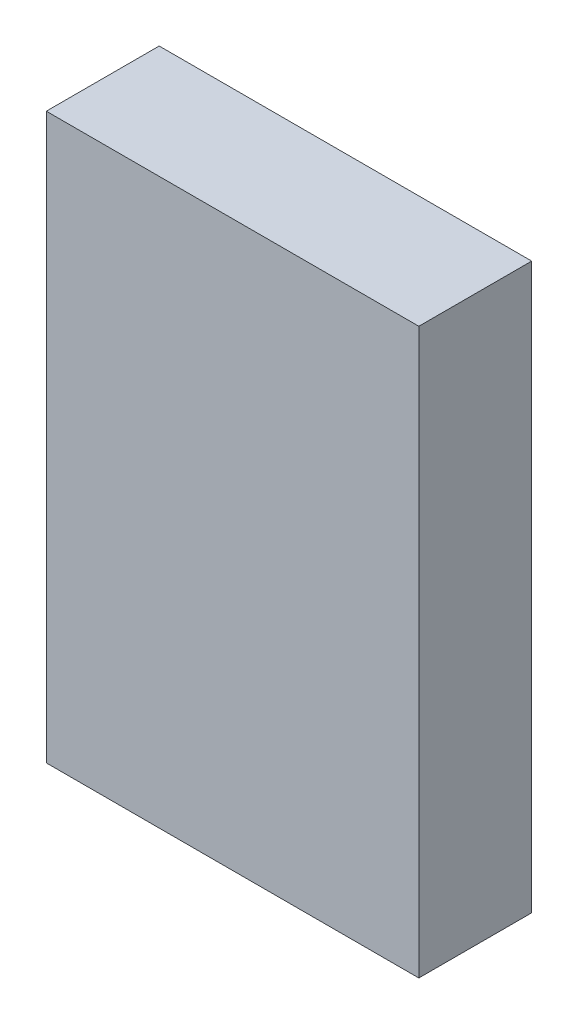
ISO-10303-21;
HEADER;
FILE_DESCRIPTION(('STEP AP214'),'2;1');
FILE_NAME('part.step','',(''),(''),'','','');
FILE_SCHEMA(('AUTOMOTIVE_DESIGN { 1 0 10303 214 1 1 1 1 }'));
ENDSEC;
DATA;
#1=APPLICATION_CONTEXT('core data for automotive mechanical design processes');
#2=APPLICATION_PROTOCOL_DEFINITION('international standard','automotive_design',2000,#1);
#3=PRODUCT_CONTEXT('',#1,'mechanical');
#4=PRODUCT('Part','Part','',(#3));
#5=PRODUCT_RELATED_PRODUCT_CATEGORY('part','',(#4));
#6=PRODUCT_DEFINITION_FORMATION('','',#4);
#7=PRODUCT_DEFINITION_CONTEXT('part definition',#1,'design');
#8=PRODUCT_DEFINITION('design','',#6,#7);
#9=PRODUCT_DEFINITION_SHAPE('','',#8);
#10=(LENGTH_UNIT() NAMED_UNIT(*) SI_UNIT(.MILLI.,.METRE.));
#11=(NAMED_UNIT(*) PLANE_ANGLE_UNIT() SI_UNIT($,.RADIAN.));
#12=(NAMED_UNIT(*) SI_UNIT($,.STERADIAN.) SOLID_ANGLE_UNIT());
#13=UNCERTAINTY_MEASURE_WITH_UNIT(LENGTH_MEASURE(1.E-05),#10,'distance_accuracy_value','');
#14=(GEOMETRIC_REPRESENTATION_CONTEXT(3) GLOBAL_UNCERTAINTY_ASSIGNED_CONTEXT((#13)) GLOBAL_UNIT_ASSIGNED_CONTEXT((#10,
#11,#12)) REPRESENTATION_CONTEXT('',''));
#15=CARTESIAN_POINT('',(0.,0.,0.));
#16=DIRECTION('',(0.,0.,1.));
#17=DIRECTION('',(1.,0.,0.));
#18=AXIS2_PLACEMENT_3D('',#15,#16,#17);
#19=CARTESIAN_POINT('',(39.490000588596,14.510000216067,1.));
#20=CARTESIAN_POINT('',(42.810000588596,14.510000216067,1.));
#21=CARTESIAN_POINT('',(39.490000588596,9.490000216067,1.));
#22=CARTESIAN_POINT('',(42.810000588596,9.490000216067,1.));
#23=(BOUNDED_SURFACE() B_SPLINE_SURFACE(1,1,((#19,#20),(#21,#22)),.UNSPECIFIED.,.F.,.F.,
.F.) B_SPLINE_SURFACE_WITH_KNOTS((2,2),(2,2),(-0.251,0.251),(-0.166,0.166),
.UNSPECIFIED.) GEOMETRIC_REPRESENTATION_ITEM() RATIONAL_B_SPLINE_SURFACE(((1.,1.),(1.,1.))) REPRESENTATION_ITEM('') SURFACE());
#24=CARTESIAN_POINT('',(39.500000588596,9.500000216067,1.));
#25=CARTESIAN_POINT('',(42.800000588596,9.500000216067,1.));
#26=(BOUNDED_CURVE() B_SPLINE_CURVE(1,(#24,#25),.UNSPECIFIED.,.F.,
.F.) B_SPLINE_CURVE_WITH_KNOTS((2,2),(-0.165,0.165),
.UNSPECIFIED.) CURVE() GEOMETRIC_REPRESENTATION_ITEM() RATIONAL_B_SPLINE_CURVE((1.,1.)) REPRESENTATION_ITEM(''));
#27=CARTESIAN_POINT('',(39.500000588596,9.500000216067,1.));
#28=VERTEX_POINT('',#27);
#29=CARTESIAN_POINT('',(42.800000588596,9.500000216067,1.));
#30=VERTEX_POINT('',#29);
#31=EDGE_CURVE('E93',#28,#30,#26,.T.);
#32=CARTESIAN_POINT('',(42.800000588596,9.500000216067,1.));
#33=CARTESIAN_POINT('',(42.800000588596,14.500000216067,1.));
#34=(BOUNDED_CURVE() B_SPLINE_CURVE(1,(#32,#33),.UNSPECIFIED.,.F.,
.F.) B_SPLINE_CURVE_WITH_KNOTS((2,2),(-0.25,0.25),
.UNSPECIFIED.) CURVE() GEOMETRIC_REPRESENTATION_ITEM() RATIONAL_B_SPLINE_CURVE((1.,1.)) REPRESENTATION_ITEM(''));
#35=CARTESIAN_POINT('',(42.800000588596,14.500000216067,1.));
#36=VERTEX_POINT('',#35);
#37=EDGE_CURVE('E92',#30,#36,#34,.T.);
#38=CARTESIAN_POINT('',(42.800000588596,14.500000216067,1.));
#39=CARTESIAN_POINT('',(39.500000588596,14.500000216067,1.));
#40=(BOUNDED_CURVE() B_SPLINE_CURVE(1,(#38,#39),.UNSPECIFIED.,.F.,
.F.) B_SPLINE_CURVE_WITH_KNOTS((2,2),(-0.165,0.165),
.UNSPECIFIED.) CURVE() GEOMETRIC_REPRESENTATION_ITEM() RATIONAL_B_SPLINE_CURVE((1.,1.)) REPRESENTATION_ITEM(''));
#41=CARTESIAN_POINT('',(39.500000588596,14.500000216067,1.));
#42=VERTEX_POINT('',#41);
#43=EDGE_CURVE('E83',#36,#42,#40,.T.);
#44=CARTESIAN_POINT('',(39.500000588596,14.500000216067,1.));
#45=CARTESIAN_POINT('',(39.500000588596,9.500000216067,1.));
#46=(BOUNDED_CURVE() B_SPLINE_CURVE(1,(#44,#45),.UNSPECIFIED.,.F.,
.F.) B_SPLINE_CURVE_WITH_KNOTS((2,2),(-0.25,0.25),
.UNSPECIFIED.) CURVE() GEOMETRIC_REPRESENTATION_ITEM() RATIONAL_B_SPLINE_CURVE((1.,1.)) REPRESENTATION_ITEM(''));
#47=EDGE_CURVE('E11',#42,#28,#46,.T.);
#48=ORIENTED_EDGE('',*,*,#31,.T.);
#49=ORIENTED_EDGE('',*,*,#37,.T.);
#50=ORIENTED_EDGE('',*,*,#43,.T.);
#51=ORIENTED_EDGE('',*,*,#47,.T.);
#52=EDGE_LOOP('',(#48,#49,#50,#51));
#53=FACE_BOUND('',#52,.T.);
#54=ADVANCED_FACE('F17',(#53),#23,.T.);
#55=CARTESIAN_POINT('',(39.490000588596,9.490000216067,0.));
#56=CARTESIAN_POINT('',(42.810000588596,9.490000216067,0.));
#57=CARTESIAN_POINT('',(39.490000588596,14.510000216067,0.));
#58=CARTESIAN_POINT('',(42.810000588596,14.510000216067,0.));
#59=(BOUNDED_SURFACE() B_SPLINE_SURFACE(1,1,((#55,#56),(#57,#58)),.UNSPECIFIED.,.F.,.F.,
.F.) B_SPLINE_SURFACE_WITH_KNOTS((2,2),(2,2),(-0.251,0.251),(-0.166,0.166),
.UNSPECIFIED.) GEOMETRIC_REPRESENTATION_ITEM() RATIONAL_B_SPLINE_SURFACE(((1.,1.),(1.,1.))) REPRESENTATION_ITEM('') SURFACE());
#60=CARTESIAN_POINT('',(42.800000588596,9.500000216067,0.));
#61=CARTESIAN_POINT('',(39.500000588596,9.500000216067,0.));
#62=(BOUNDED_CURVE() B_SPLINE_CURVE(1,(#60,#61),.UNSPECIFIED.,.F.,
.F.) B_SPLINE_CURVE_WITH_KNOTS((2,2),(-0.165,0.165),
.UNSPECIFIED.) CURVE() GEOMETRIC_REPRESENTATION_ITEM() RATIONAL_B_SPLINE_CURVE((1.,1.)) REPRESENTATION_ITEM(''));
#63=CARTESIAN_POINT('',(42.800000588596,9.500000216067,0.));
#64=VERTEX_POINT('',#63);
#65=CARTESIAN_POINT('',(39.500000588596,9.500000216067,0.));
#66=VERTEX_POINT('',#65);
#67=EDGE_CURVE('E23',#64,#66,#62,.T.);
#68=CARTESIAN_POINT('',(39.500000588596,9.500000216067,0.));
#69=CARTESIAN_POINT('',(39.500000588596,14.500000216067,0.));
#70=(BOUNDED_CURVE() B_SPLINE_CURVE(1,(#68,#69),.UNSPECIFIED.,.F.,
.F.) B_SPLINE_CURVE_WITH_KNOTS((2,2),(-0.25,0.25),
.UNSPECIFIED.) CURVE() GEOMETRIC_REPRESENTATION_ITEM() RATIONAL_B_SPLINE_CURVE((1.,1.)) REPRESENTATION_ITEM(''));
#71=CARTESIAN_POINT('',(39.500000588596,14.500000216067,0.));
#72=VERTEX_POINT('',#71);
#73=EDGE_CURVE('E32',#66,#72,#70,.T.);
#74=CARTESIAN_POINT('',(39.500000588596,14.500000216067,0.));
#75=CARTESIAN_POINT('',(42.800000588596,14.500000216067,0.));
#76=(BOUNDED_CURVE() B_SPLINE_CURVE(1,(#74,#75),.UNSPECIFIED.,.F.,
.F.) B_SPLINE_CURVE_WITH_KNOTS((2,2),(-0.165,0.165),
.UNSPECIFIED.) CURVE() GEOMETRIC_REPRESENTATION_ITEM() RATIONAL_B_SPLINE_CURVE((1.,1.)) REPRESENTATION_ITEM(''));
#77=CARTESIAN_POINT('',(42.800000588596,14.500000216067,0.));
#78=VERTEX_POINT('',#77);
#79=EDGE_CURVE('E76',#72,#78,#76,.T.);
#80=CARTESIAN_POINT('',(42.800000588596,14.500000216067,0.));
#81=CARTESIAN_POINT('',(42.800000588596,9.500000216067,0.));
#82=(BOUNDED_CURVE() B_SPLINE_CURVE(1,(#80,#81),.UNSPECIFIED.,.F.,
.F.) B_SPLINE_CURVE_WITH_KNOTS((2,2),(-0.25,0.25),
.UNSPECIFIED.) CURVE() GEOMETRIC_REPRESENTATION_ITEM() RATIONAL_B_SPLINE_CURVE((1.,1.)) REPRESENTATION_ITEM(''));
#83=EDGE_CURVE('E100',#78,#64,#82,.T.);
#84=ORIENTED_EDGE('',*,*,#67,.T.);
#85=ORIENTED_EDGE('',*,*,#73,.T.);
#86=ORIENTED_EDGE('',*,*,#79,.T.);
#87=ORIENTED_EDGE('',*,*,#83,.T.);
#88=EDGE_LOOP('',(#84,#85,#86,#87));
#89=FACE_BOUND('',#88,.T.);
#90=ADVANCED_FACE('F169',(#89),#59,.T.);
#91=CARTESIAN_POINT('',(39.500000588596,14.510000216067,1.01));
#92=CARTESIAN_POINT('',(39.500000588596,9.490000216067,1.01));
#93=CARTESIAN_POINT('',(39.500000588596,14.510000216067,-0.01));
#94=CARTESIAN_POINT('',(39.500000588596,9.490000216067,-0.01));
#95=(BOUNDED_SURFACE() B_SPLINE_SURFACE(1,1,((#91,#92),(#93,#94)),.UNSPECIFIED.,.F.,.F.,
.F.) B_SPLINE_SURFACE_WITH_KNOTS((2,2),(2,2),(-0.051,0.051),(-0.251,0.251),
.UNSPECIFIED.) GEOMETRIC_REPRESENTATION_ITEM() RATIONAL_B_SPLINE_SURFACE(((1.,1.),(1.,1.))) REPRESENTATION_ITEM('') SURFACE());
#96=CARTESIAN_POINT('',(39.500000588596,14.500000216067,1.));
#97=CARTESIAN_POINT('',(39.500000588596,14.500000216067,0.));
#98=(BOUNDED_CURVE() B_SPLINE_CURVE(1,(#96,#97),.UNSPECIFIED.,.F.,
.F.) B_SPLINE_CURVE_WITH_KNOTS((2,2),(-0.05,0.05),
.UNSPECIFIED.) CURVE() GEOMETRIC_REPRESENTATION_ITEM() RATIONAL_B_SPLINE_CURVE((1.,1.)) REPRESENTATION_ITEM(''));
#99=EDGE_CURVE('E89',#42,#72,#98,.T.);
#100=CARTESIAN_POINT('',(39.500000588596,9.500000216067,1.));
#101=CARTESIAN_POINT('',(39.500000588596,9.500000216067,0.));
#102=(BOUNDED_CURVE() B_SPLINE_CURVE(1,(#100,#101),.UNSPECIFIED.,.F.,
.F.) B_SPLINE_CURVE_WITH_KNOTS((2,2),(-0.05,0.05),
.UNSPECIFIED.) CURVE() GEOMETRIC_REPRESENTATION_ITEM() RATIONAL_B_SPLINE_CURVE((1.,1.)) REPRESENTATION_ITEM(''));
#103=EDGE_CURVE('E223',#28,#66,#102,.T.);
#104=ORIENTED_EDGE('',*,*,#99,.T.);
#105=ORIENTED_EDGE('',*,*,#73,.F.);
#106=ORIENTED_EDGE('',*,*,#103,.F.);
#107=ORIENTED_EDGE('',*,*,#47,.F.);
#108=EDGE_LOOP('',(#104,#105,#106,#107));
#109=FACE_BOUND('',#108,.T.);
#110=ADVANCED_FACE('F19',(#109),#95,.T.);
#111=CARTESIAN_POINT('',(39.490000588596,14.500000216067,-0.01));
#112=CARTESIAN_POINT('',(42.810000588596,14.500000216067,-0.01));
#113=CARTESIAN_POINT('',(39.490000588596,14.500000216067,1.01));
#114=CARTESIAN_POINT('',(42.810000588596,14.500000216067,1.01));
#115=(BOUNDED_SURFACE() B_SPLINE_SURFACE(1,1,((#111,#112),(#113,#114)),.UNSPECIFIED.,.F.,.F.,
.F.) B_SPLINE_SURFACE_WITH_KNOTS((2,2),(2,2),(-0.051,0.051),(-0.166,0.166),
.UNSPECIFIED.) GEOMETRIC_REPRESENTATION_ITEM() RATIONAL_B_SPLINE_SURFACE(((1.,1.),(1.,1.))) REPRESENTATION_ITEM('') SURFACE());
#116=CARTESIAN_POINT('',(42.800000588596,14.500000216067,1.));
#117=CARTESIAN_POINT('',(42.800000588596,14.500000216067,0.));
#118=(BOUNDED_CURVE() B_SPLINE_CURVE(1,(#116,#117),.UNSPECIFIED.,.F.,
.F.) B_SPLINE_CURVE_WITH_KNOTS((2,2),(-0.05,0.05),
.UNSPECIFIED.) CURVE() GEOMETRIC_REPRESENTATION_ITEM() RATIONAL_B_SPLINE_CURVE((1.,1.)) REPRESENTATION_ITEM(''));
#119=EDGE_CURVE('E87',#36,#78,#118,.T.);
#120=ORIENTED_EDGE('',*,*,#119,.T.);
#121=ORIENTED_EDGE('',*,*,#79,.F.);
#122=ORIENTED_EDGE('',*,*,#99,.F.);
#123=ORIENTED_EDGE('',*,*,#43,.F.);
#124=EDGE_LOOP('',(#120,#121,#122,#123));
#125=FACE_BOUND('',#124,.T.);
#126=ADVANCED_FACE('F85',(#125),#115,.T.);
#127=CARTESIAN_POINT('',(42.800000588596,14.510000216067,-0.01));
#128=CARTESIAN_POINT('',(42.800000588596,9.490000216067,-0.01));
#129=CARTESIAN_POINT('',(42.800000588596,14.510000216067,1.01));
#130=CARTESIAN_POINT('',(42.800000588596,9.490000216067,1.01));
#131=(BOUNDED_SURFACE() B_SPLINE_SURFACE(1,1,((#127,#128),(#129,#130)),.UNSPECIFIED.,.F.,.F.,
.F.) B_SPLINE_SURFACE_WITH_KNOTS((2,2),(2,2),(-0.051,0.051),(-0.251,0.251),
.UNSPECIFIED.) GEOMETRIC_REPRESENTATION_ITEM() RATIONAL_B_SPLINE_SURFACE(((1.,1.),(1.,1.))) REPRESENTATION_ITEM('') SURFACE());
#132=CARTESIAN_POINT('',(42.800000588596,9.500000216067,1.));
#133=CARTESIAN_POINT('',(42.800000588596,9.500000216067,0.));
#134=(BOUNDED_CURVE() B_SPLINE_CURVE(1,(#132,#133),.UNSPECIFIED.,.F.,
.F.) B_SPLINE_CURVE_WITH_KNOTS((2,2),(-0.05,0.05),
.UNSPECIFIED.) CURVE() GEOMETRIC_REPRESENTATION_ITEM() RATIONAL_B_SPLINE_CURVE((1.,1.)) REPRESENTATION_ITEM(''));
#135=EDGE_CURVE('E124',#30,#64,#134,.T.);
#136=ORIENTED_EDGE('',*,*,#135,.T.);
#137=ORIENTED_EDGE('',*,*,#83,.F.);
#138=ORIENTED_EDGE('',*,*,#119,.F.);
#139=ORIENTED_EDGE('',*,*,#37,.F.);
#140=EDGE_LOOP('',(#136,#137,#138,#139));
#141=FACE_BOUND('',#140,.T.);
#142=ADVANCED_FACE('F99',(#141),#131,.T.);
#143=CARTESIAN_POINT('',(39.490000588596,9.500000216067,1.01));
#144=CARTESIAN_POINT('',(42.810000588596,9.500000216067,1.01));
#145=CARTESIAN_POINT('',(39.490000588596,9.500000216067,-0.01));
#146=CARTESIAN_POINT('',(42.810000588596,9.500000216067,-0.01));
#147=(BOUNDED_SURFACE() B_SPLINE_SURFACE(1,1,((#143,#144),(#145,#146)),.UNSPECIFIED.,.F.,.F.,
.F.) B_SPLINE_SURFACE_WITH_KNOTS((2,2),(2,2),(-0.051,0.051),(-0.166,0.166),
.UNSPECIFIED.) GEOMETRIC_REPRESENTATION_ITEM() RATIONAL_B_SPLINE_SURFACE(((1.,1.),(1.,1.))) REPRESENTATION_ITEM('') SURFACE());
#148=ORIENTED_EDGE('',*,*,#103,.T.);
#149=ORIENTED_EDGE('',*,*,#67,.F.);
#150=ORIENTED_EDGE('',*,*,#135,.F.);
#151=ORIENTED_EDGE('',*,*,#31,.F.);
#152=EDGE_LOOP('',(#148,#149,#150,#151));
#153=FACE_BOUND('',#152,.T.);
#154=ADVANCED_FACE('F196',(#153),#147,.T.);
#155=CLOSED_SHELL('',(#54,#90,#110,#126,#142,#154));
#156=MANIFOLD_SOLID_BREP('B1',#155);
#157=ADVANCED_BREP_SHAPE_REPRESENTATION('',(#18,#156),#14);
#158=SHAPE_DEFINITION_REPRESENTATION(#9,#157);
ENDSEC;
END-ISO-10303-21;
